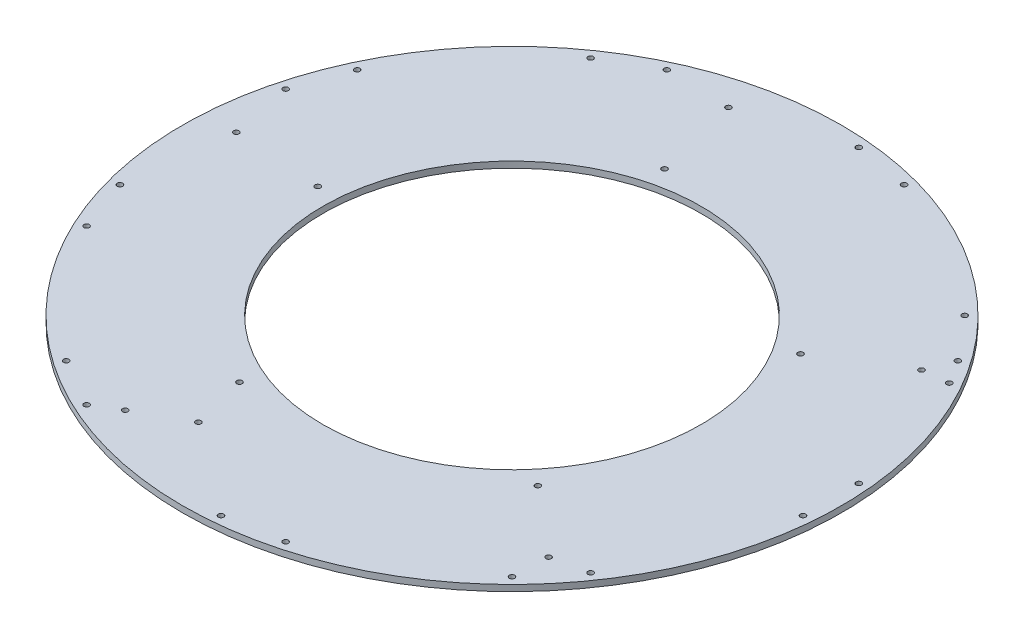
ISO-10303-21;
HEADER;
FILE_DESCRIPTION(('STEP AP214'),'2;1');
FILE_NAME('part.step','',(''),(''),'','','');
FILE_SCHEMA(('AUTOMOTIVE_DESIGN { 1 0 10303 214 1 1 1 1 }'));
ENDSEC;
DATA;
#1=APPLICATION_CONTEXT('core data for automotive mechanical design processes');
#2=APPLICATION_PROTOCOL_DEFINITION('international standard','automotive_design',2000,#1);
#3=PRODUCT_CONTEXT('',#1,'mechanical');
#4=PRODUCT('Part','Part','',(#3));
#5=PRODUCT_RELATED_PRODUCT_CATEGORY('part','',(#4));
#6=PRODUCT_DEFINITION_FORMATION('','',#4);
#7=PRODUCT_DEFINITION_CONTEXT('part definition',#1,'design');
#8=PRODUCT_DEFINITION('design','',#6,#7);
#9=PRODUCT_DEFINITION_SHAPE('','',#8);
#10=(LENGTH_UNIT() NAMED_UNIT(*) SI_UNIT(.MILLI.,.METRE.));
#11=(NAMED_UNIT(*) PLANE_ANGLE_UNIT() SI_UNIT($,.RADIAN.));
#12=(NAMED_UNIT(*) SI_UNIT($,.STERADIAN.) SOLID_ANGLE_UNIT());
#13=UNCERTAINTY_MEASURE_WITH_UNIT(LENGTH_MEASURE(1.E-05),#10,'distance_accuracy_value','');
#14=(GEOMETRIC_REPRESENTATION_CONTEXT(3) GLOBAL_UNCERTAINTY_ASSIGNED_CONTEXT((#13)) GLOBAL_UNIT_ASSIGNED_CONTEXT((#10,
#11,#12)) REPRESENTATION_CONTEXT('',''));
#15=CARTESIAN_POINT('',(0.,0.,0.));
#16=DIRECTION('',(0.,0.,1.));
#17=DIRECTION('',(1.,0.,0.));
#18=AXIS2_PLACEMENT_3D('',#15,#16,#17);
#19=CARTESIAN_POINT('',(0.,5.842,0.));
#20=DIRECTION('',(0.,1.,0.));
#21=DIRECTION('',(0.,0.,1.));
#22=AXIS2_PLACEMENT_3D('',#19,#20,#21);
#23=PLANE('',#22);
#24=CARTESIAN_POINT('',(-60.4787332351286,5.842,234.445699952621));
#25=DIRECTION('',(0.,1.,0.));
#26=DIRECTION('',(0.,0.,1.));
#27=AXIS2_PLACEMENT_3D('',#24,#25,#26);
#28=CIRCLE('',#27,2.5527);
#29=CARTESIAN_POINT('',(-60.4787332351286,5.842,236.998399952621));
#30=VERTEX_POINT('',#29);
#31=EDGE_CURVE('E223',#30,#30,#28,.T.);
#32=ORIENTED_EDGE('',*,*,#31,.F.);
#33=EDGE_LOOP('',(#32));
#34=FACE_BOUND('',#33,.T.);
#35=CARTESIAN_POINT('',(260.664986285079,5.842,-150.494999999998));
#36=DIRECTION('',(0.,1.,0.));
#37=DIRECTION('',(0.,0.,1.));
#38=AXIS2_PLACEMENT_3D('',#35,#36,#37);
#39=CIRCLE('',#38,2.55270000000006);
#40=CARTESIAN_POINT('',(260.664986285079,5.842,-147.942299999998));
#41=VERTEX_POINT('',#40);
#42=EDGE_CURVE('E217',#41,#41,#39,.T.);
#43=ORIENTED_EDGE('',*,*,#42,.F.);
#44=EDGE_LOOP('',(#43));
#45=FACE_BOUND('',#44,.T.);
#46=CARTESIAN_POINT('',(-104.665082200409,5.842,259.055168965959));
#47=DIRECTION('',(0.,1.,0.));
#48=DIRECTION('',(0.95105651629515,0.,0.309016994374958));
#49=AXIS2_PLACEMENT_3D('',#46,#47,#48);
#50=CIRCLE('',#49,2.55270000000004);
#51=CARTESIAN_POINT('',(-102.237320231262,5.842,259.8439966475));
#52=VERTEX_POINT('',#51);
#53=EDGE_CURVE('E175',#52,#52,#50,.T.);
#54=ORIENTED_EDGE('',*,*,#53,.F.);
#55=EDGE_LOOP('',(#54));
#56=FACE_BOUND('',#55,.T.);
#57=CARTESIAN_POINT('',(-73.7413079139244,5.842,182.516141771471));
#58=DIRECTION('',(0.,1.,0.));
#59=DIRECTION('',(0.95105651629515,0.,0.309016994374958));
#60=AXIS2_PLACEMENT_3D('',#57,#58,#59);
#61=CIRCLE('',#60,2.55269999999998);
#62=CARTESIAN_POINT('',(-71.3135459447778,5.842,183.304969453012));
#63=VERTEX_POINT('',#62);
#64=EDGE_CURVE('E182',#63,#63,#61,.T.);
#65=ORIENTED_EDGE('',*,*,#64,.F.);
#66=EDGE_LOOP('',(#65));
#67=FACE_BOUND('',#66,.T.);
#68=CARTESIAN_POINT('',(214.032817407441,5.842,179.594858146421));
#69=DIRECTION('',(0.,1.,0.));
#70=DIRECTION('',(0.58778525229248,0.,-0.809016994374942));
#71=AXIS2_PLACEMENT_3D('',#68,#69,#70);
#72=CIRCLE('',#71,2.55270000000004);
#73=CARTESIAN_POINT('',(215.533256820968,5.842,177.52968046488));
#74=VERTEX_POINT('',#73);
#75=EDGE_CURVE('E188',#74,#74,#72,.T.);
#76=ORIENTED_EDGE('',*,*,#75,.F.);
#77=EDGE_LOOP('',(#76));
#78=FACE_BOUND('',#77,.T.);
#79=CARTESIAN_POINT('',(-67.5929776305464,5.842,-271.100625921514));
#80=DIRECTION('',(0.,1.,0.));
#81=DIRECTION('',(-0.951056516295155,0.,0.309016994374945));
#82=AXIS2_PLACEMENT_3D('',#79,#80,#81);
#83=CIRCLE('',#82,2.55270000000004);
#84=CARTESIAN_POINT('',(-70.0207395996931,5.842,-270.311798239973));
#85=VERTEX_POINT('',#84);
#86=EDGE_CURVE('E202',#85,#85,#83,.T.);
#87=ORIENTED_EDGE('',*,*,#86,.F.);
#88=EDGE_LOOP('',(#87));
#89=FACE_BOUND('',#88,.T.);
#90=CARTESIAN_POINT('',(166.938267728393,5.842,-104.314607164305));
#91=DIRECTION('',(0.,1.,0.));
#92=DIRECTION('',(-0.587785252292469,0.,-0.809016994374951));
#93=AXIS2_PLACEMENT_3D('',#90,#91,#92);
#94=CIRCLE('',#93,2.55269999999998);
#95=CARTESIAN_POINT('',(165.437828314866,5.842,-106.379784845846));
#96=VERTEX_POINT('',#95);
#97=EDGE_CURVE('E195',#96,#96,#94,.T.);
#98=ORIENTED_EDGE('',*,*,#97,.F.);
#99=EDGE_LOOP('',(#98));
#100=FACE_BOUND('',#99,.T.);
#101=CARTESIAN_POINT('',(236.944638066106,5.842,-148.059442426756));
#102=DIRECTION('',(0.,1.,0.));
#103=DIRECTION('',(-0.587785252292469,0.,-0.809016994374951));
#104=AXIS2_PLACEMENT_3D('',#101,#102,#103);
#105=CIRCLE('',#104,2.55270000000004);
#106=CARTESIAN_POINT('',(235.444198652579,5.842,-150.124620108297));
#107=VERTEX_POINT('',#106);
#108=EDGE_CURVE('E212',#107,#107,#105,.T.);
#109=ORIENTED_EDGE('',*,*,#108,.F.);
#110=EDGE_LOOP('',(#109));
#111=FACE_BOUND('',#110,.T.);
#112=CARTESIAN_POINT('',(150.79584862797,5.842,126.532740966797));
#113=DIRECTION('',(0.,1.,0.));
#114=DIRECTION('',(0.58778525229248,0.,-0.809016994374942));
#115=AXIS2_PLACEMENT_3D('',#112,#113,#114);
#116=CIRCLE('',#115,2.55269999999998);
#117=CARTESIAN_POINT('',(152.296288041497,5.842,124.467563285256));
#118=VERTEX_POINT('',#117);
#119=EDGE_CURVE('E194',#118,#118,#116,.T.);
#120=ORIENTED_EDGE('',*,*,#119,.F.);
#121=EDGE_LOOP('',(#120));
#122=FACE_BOUND('',#121,.T.);
#123=CARTESIAN_POINT('',(-47.6223251487941,5.842,-191.00271371743));
#124=DIRECTION('',(0.,1.,0.));
#125=DIRECTION('',(-0.951056516295155,0.,0.309016994374945));
#126=AXIS2_PLACEMENT_3D('',#123,#124,#125);
#127=CIRCLE('',#126,2.55269999999998);
#128=CARTESIAN_POINT('',(-50.0500871179407,5.842,-190.213886035889));
#129=VERTEX_POINT('',#128);
#130=EDGE_CURVE('E169',#129,#129,#127,.T.);
#131=ORIENTED_EDGE('',*,*,#130,.F.);
#132=EDGE_LOOP('',(#131));
#133=FACE_BOUND('',#132,.T.);
#134=CARTESIAN_POINT('',(-196.370483293646,5.842,-13.7315618565311));
#135=DIRECTION('',(0.,1.,0.));
#136=DIRECTION('',(0.,0.,1.));
#137=AXIS2_PLACEMENT_3D('',#134,#135,#136);
#138=CIRCLE('',#137,2.55269999999998);
#139=CARTESIAN_POINT('',(-196.370483293646,5.842,-11.1788618565311));
#140=VERTEX_POINT('',#139);
#141=EDGE_CURVE('E164',#140,#140,#138,.T.);
#142=ORIENTED_EDGE('',*,*,#141,.F.);
#143=EDGE_LOOP('',(#142));
#144=FACE_BOUND('',#143,.T.);
#145=CARTESIAN_POINT('',(-278.719395642595,5.842,-19.4899587641086));
#146=DIRECTION('',(0.,1.,0.));
#147=DIRECTION('',(0.,0.,1.));
#148=AXIS2_PLACEMENT_3D('',#145,#146,#147);
#149=CIRCLE('',#148,2.55270000000004);
#150=CARTESIAN_POINT('',(-278.719395642595,5.842,-16.9372587641086));
#151=VERTEX_POINT('',#150);
#152=EDGE_CURVE('E157',#151,#151,#149,.T.);
#153=ORIENTED_EDGE('',*,*,#152,.F.);
#154=EDGE_LOOP('',(#153));
#155=FACE_BOUND('',#154,.T.);
#156=CARTESIAN_POINT('',(-272.789580820163,5.842,127.20387060133));
#157=DIRECTION('',(0.,1.,0.));
#158=DIRECTION('',(0.64278760968653,0.,0.766044443118986));
#159=AXIS2_PLACEMENT_3D('',#156,#157,#158);
#160=CIRCLE('',#159,2.55270000000004);
#161=CARTESIAN_POINT('',(-271.148736888916,5.842,129.15935225128));
#162=VERTEX_POINT('',#161);
#163=EDGE_CURVE('E67',#162,#162,#160,.T.);
#164=ORIENTED_EDGE('',*,*,#163,.F.);
#165=EDGE_LOOP('',(#164));
#166=FACE_BOUND('',#165,.T.);
#167=CARTESIAN_POINT('',(-172.640771577304,5.842,246.556573810542));
#168=DIRECTION('',(0.,1.,0.));
#169=DIRECTION('',(0.64278760968653,0.,0.766044443118986));
#170=AXIS2_PLACEMENT_3D('',#167,#168,#169);
#171=CIRCLE('',#170,2.55270000000004);
#172=CARTESIAN_POINT('',(-170.999927646057,5.842,248.512055460492));
#173=VERTEX_POINT('',#172);
#174=EDGE_CURVE('E74',#173,#173,#171,.T.);
#175=ORIENTED_EDGE('',*,*,#174,.F.);
#176=EDGE_LOOP('',(#175));
#177=FACE_BOUND('',#176,.T.);
#178=CARTESIAN_POINT('',(-127.203870601336,5.842,272.78958082016));
#179=DIRECTION('',(0.,1.,0.));
#180=DIRECTION('',(0.984807753012206,0.,0.17364817766694));
#181=AXIS2_PLACEMENT_3D('',#178,#179,#180);
#182=CIRCLE('',#181,2.55270000000004);
#183=CARTESIAN_POINT('',(-124.689951850222,5.842,273.23285252329));
#184=VERTEX_POINT('',#183);
#185=EDGE_CURVE('E80',#184,#184,#182,.T.);
#186=ORIENTED_EDGE('',*,*,#185,.F.);
#187=EDGE_LOOP('',(#186));
#188=FACE_BOUND('',#187,.T.);
#189=CARTESIAN_POINT('',(26.2330070096147,5.842,299.844642178635));
#190=DIRECTION('',(0.,1.,0.));
#191=DIRECTION('',(0.984807753012206,0.,0.17364817766694));
#192=AXIS2_PLACEMENT_3D('',#189,#190,#191);
#193=CIRCLE('',#192,2.55270000000004);
#194=CARTESIAN_POINT('',(28.746925760729,5.842,300.287913881765));
#195=VERTEX_POINT('',#194);
#196=EDGE_CURVE('E86',#195,#195,#193,.T.);
#197=ORIENTED_EDGE('',*,*,#196,.F.);
#198=EDGE_LOOP('',(#197));
#199=FACE_BOUND('',#198,.T.);
#200=CARTESIAN_POINT('',(77.9019443854049,5.842,290.734014454747));
#201=DIRECTION('',(0.,1.,0.));
#202=DIRECTION('',(0.866025403784443,0.,-0.499999999999992));
#203=AXIS2_PLACEMENT_3D('',#200,#201,#202);
#204=CIRCLE('',#203,2.55270000000004);
#205=CARTESIAN_POINT('',(80.1126474336454,5.842,289.457664454747));
#206=VERTEX_POINT('',#205);
#207=EDGE_CURVE('E92',#206,#206,#204,.T.);
#208=ORIENTED_EDGE('',*,*,#207,.F.);
#209=EDGE_LOOP('',(#208));
#210=FACE_BOUND('',#209,.T.);
#211=CARTESIAN_POINT('',(212.832070069337,5.842,212.832070069341));
#212=DIRECTION('',(0.,1.,0.));
#213=DIRECTION('',(0.866025403784443,0.,-0.499999999999992));
#214=AXIS2_PLACEMENT_3D('',#211,#212,#213);
#215=CIRCLE('',#214,2.55270000000004);
#216=CARTESIAN_POINT('',(215.042773117578,5.842,211.555720069341));
#217=VERTEX_POINT('',#216);
#218=EDGE_CURVE('E98',#217,#217,#215,.T.);
#219=ORIENTED_EDGE('',*,*,#218,.F.);
#220=EDGE_LOOP('',(#219));
#221=FACE_BOUND('',#220,.T.);
#222=CARTESIAN_POINT('',(246.556573810542,5.842,172.640771577303));
#223=DIRECTION('',(0.,1.,0.));
#224=DIRECTION('',(0.342020143325676,0.,-0.939692620785906));
#225=AXIS2_PLACEMENT_3D('',#222,#223,#224);
#226=CIRCLE('',#225,2.55270000000004);
#227=CARTESIAN_POINT('',(247.42964863041,5.842,170.242018224223));
#228=VERTEX_POINT('',#227);
#229=EDGE_CURVE('E104',#228,#228,#226,.T.);
#230=ORIENTED_EDGE('',*,*,#229,.F.);
#231=EDGE_LOOP('',(#230));
#232=FACE_BOUND('',#231,.T.);
#233=CARTESIAN_POINT('',(299.844642178634,5.842,26.2330070096197));
#234=DIRECTION('',(0.,1.,0.));
#235=DIRECTION('',(0.342020143325676,0.,-0.939692620785906));
#236=AXIS2_PLACEMENT_3D('',#233,#234,#235);
#237=CIRCLE('',#236,2.55270000000004);
#238=CARTESIAN_POINT('',(300.717716998502,5.842,23.8342536565395));
#239=VERTEX_POINT('',#238);
#240=EDGE_CURVE('E110',#239,#239,#237,.T.);
#241=ORIENTED_EDGE('',*,*,#240,.F.);
#242=EDGE_LOOP('',(#241));
#243=FACE_BOUND('',#242,.T.);
#244=CARTESIAN_POINT('',(299.844642178635,5.842,-26.2330070096156));
#245=DIRECTION('',(0.,1.,0.));
#246=DIRECTION('',(-0.342020143325663,0.,-0.939692620785911));
#247=AXIS2_PLACEMENT_3D('',#244,#245,#246);
#248=CIRCLE('',#247,2.55270000000004);
#249=CARTESIAN_POINT('',(298.971567358767,5.842,-28.6317603626959));
#250=VERTEX_POINT('',#249);
#251=EDGE_CURVE('E116',#250,#250,#248,.T.);
#252=ORIENTED_EDGE('',*,*,#251,.F.);
#253=EDGE_LOOP('',(#252));
#254=FACE_BOUND('',#253,.T.);
#255=CARTESIAN_POINT('',(246.556573810545,5.842,-172.6407715773));
#256=DIRECTION('',(0.,1.,0.));
#257=DIRECTION('',(-0.342020143325663,0.,-0.939692620785911));
#258=AXIS2_PLACEMENT_3D('',#255,#256,#257);
#259=CIRCLE('',#258,2.55270000000004);
#260=CARTESIAN_POINT('',(245.683498990677,5.842,-175.03952493038));
#261=VERTEX_POINT('',#260);
#262=EDGE_CURVE('E122',#261,#261,#259,.T.);
#263=ORIENTED_EDGE('',*,*,#262,.F.);
#264=EDGE_LOOP('',(#263));
#265=FACE_BOUND('',#264,.T.);
#266=CARTESIAN_POINT('',(212.83207006934,5.842,-212.832070069338));
#267=DIRECTION('',(0.,1.,0.));
#268=DIRECTION('',(-0.866025403784436,0.,-0.500000000000004));
#269=AXIS2_PLACEMENT_3D('',#266,#267,#268);
#270=CIRCLE('',#269,2.55270000000004);
#271=CARTESIAN_POINT('',(210.6213670211,5.842,-214.108420069338));
#272=VERTEX_POINT('',#271);
#273=EDGE_CURVE('E128',#272,#272,#270,.T.);
#274=ORIENTED_EDGE('',*,*,#273,.F.);
#275=EDGE_LOOP('',(#274));
#276=FACE_BOUND('',#275,.T.);
#277=CARTESIAN_POINT('',(77.9019443854089,5.842,-290.734014454746));
#278=DIRECTION('',(0.,1.,0.));
#279=DIRECTION('',(-0.866025403784436,0.,-0.500000000000004));
#280=AXIS2_PLACEMENT_3D('',#277,#278,#279);
#281=CIRCLE('',#280,2.55270000000004);
#282=CARTESIAN_POINT('',(75.6912413371684,5.842,-292.010364454746));
#283=VERTEX_POINT('',#282);
#284=EDGE_CURVE('E134',#283,#283,#281,.T.);
#285=ORIENTED_EDGE('',*,*,#284,.F.);
#286=EDGE_LOOP('',(#285));
#287=FACE_BOUND('',#286,.T.);
#288=CARTESIAN_POINT('',(26.2330070096187,5.842,-299.844642178634));
#289=DIRECTION('',(0.,1.,0.));
#290=DIRECTION('',(-0.984807753012209,0.,0.173648177666927));
#291=AXIS2_PLACEMENT_3D('',#288,#289,#290);
#292=CIRCLE('',#291,2.55270000000004);
#293=CARTESIAN_POINT('',(23.7190882585044,5.842,-299.401370475504));
#294=VERTEX_POINT('',#293);
#295=EDGE_CURVE('E140',#294,#294,#292,.T.);
#296=ORIENTED_EDGE('',*,*,#295,.F.);
#297=EDGE_LOOP('',(#296));
#298=FACE_BOUND('',#297,.T.);
#299=CARTESIAN_POINT('',(-127.203870601332,5.842,-272.789580820162));
#300=DIRECTION('',(0.,1.,0.));
#301=DIRECTION('',(-0.984807753012209,0.,0.173648177666927));
#302=AXIS2_PLACEMENT_3D('',#299,#300,#301);
#303=CIRCLE('',#302,2.55270000000004);
#304=CARTESIAN_POINT('',(-129.717789352447,5.842,-272.346309117031));
#305=VERTEX_POINT('',#304);
#306=EDGE_CURVE('E146',#305,#305,#303,.T.);
#307=ORIENTED_EDGE('',*,*,#306,.F.);
#308=EDGE_LOOP('',(#307));
#309=FACE_BOUND('',#308,.T.);
#310=CARTESIAN_POINT('',(-172.640771577301,5.842,-246.556573810544));
#311=DIRECTION('',(0.,1.,0.));
#312=DIRECTION('',(-0.642787609686541,0.,0.766044443118977));
#313=AXIS2_PLACEMENT_3D('',#310,#311,#312);
#314=CIRCLE('',#313,2.55270000000004);
#315=CARTESIAN_POINT('',(-174.281615508548,5.842,-244.601092160594));
#316=VERTEX_POINT('',#315);
#317=EDGE_CURVE('E152',#316,#316,#314,.T.);
#318=ORIENTED_EDGE('',*,*,#317,.F.);
#319=EDGE_LOOP('',(#318));
#320=FACE_BOUND('',#319,.T.);
#321=CARTESIAN_POINT('',(-272.789580820161,5.842,-127.203870601333));
#322=DIRECTION('',(0.,1.,0.));
#323=DIRECTION('',(-0.642787609686541,0.,0.766044443118977));
#324=AXIS2_PLACEMENT_3D('',#321,#322,#323);
#325=CIRCLE('',#324,2.55270000000004);
#326=CARTESIAN_POINT('',(-274.430424751408,5.842,-125.248388951384));
#327=VERTEX_POINT('',#326);
#328=EDGE_CURVE('E61',#327,#327,#325,.T.);
#329=ORIENTED_EDGE('',*,*,#328,.F.);
#330=EDGE_LOOP('',(#329));
#331=FACE_BOUND('',#330,.T.);
#332=CARTESIAN_POINT('',(-290.734014454747,5.842,77.9019443854079));
#333=DIRECTION('',(0.,1.,0.));
#334=DIRECTION('',(0.,0.,1.));
#335=AXIS2_PLACEMENT_3D('',#332,#333,#334);
#336=CIRCLE('',#335,2.55270000000004);
#337=CARTESIAN_POINT('',(-290.734014454747,5.842,80.4546443854079));
#338=VERTEX_POINT('',#337);
#339=EDGE_CURVE('E56',#338,#338,#336,.T.);
#340=ORIENTED_EDGE('',*,*,#339,.F.);
#341=EDGE_LOOP('',(#340));
#342=FACE_BOUND('',#341,.T.);
#343=CARTESIAN_POINT('',(-290.734014454747,5.842,-77.9019443854079));
#344=DIRECTION('',(0.,1.,0.));
#345=DIRECTION('',(0.,0.,1.));
#346=AXIS2_PLACEMENT_3D('',#343,#344,#345);
#347=CIRCLE('',#346,2.55270000000004);
#348=CARTESIAN_POINT('',(-290.734014454747,5.842,-75.3492443854079));
#349=VERTEX_POINT('',#348);
#350=EDGE_CURVE('E49',#349,#349,#347,.T.);
#351=ORIENTED_EDGE('',*,*,#350,.F.);
#352=EDGE_LOOP('',(#351));
#353=FACE_BOUND('',#352,.T.);
#354=CARTESIAN_POINT('',(0.,5.842,0.));
#355=DIRECTION('',(0.,1.,0.));
#356=DIRECTION('',(0.,0.,1.));
#357=AXIS2_PLACEMENT_3D('',#354,#355,#356);
#358=CIRCLE('',#357,309.88);
#359=CARTESIAN_POINT('',(0.,5.842,309.88));
#360=VERTEX_POINT('',#359);
#361=EDGE_CURVE('E10',#360,#360,#358,.T.);
#362=ORIENTED_EDGE('',*,*,#361,.T.);
#363=EDGE_LOOP('',(#362));
#364=FACE_BOUND('',#363,.T.);
#365=CARTESIAN_POINT('',(0.,5.842,0.));
#366=DIRECTION('',(0.,1.,0.));
#367=DIRECTION('',(0.,0.,1.));
#368=AXIS2_PLACEMENT_3D('',#365,#366,#367);
#369=CIRCLE('',#368,177.8);
#370=CARTESIAN_POINT('',(0.,5.842,177.8));
#371=VERTEX_POINT('',#370);
#372=EDGE_CURVE('E41',#371,#371,#369,.T.);
#373=ORIENTED_EDGE('',*,*,#372,.F.);
#374=EDGE_LOOP('',(#373));
#375=FACE_BOUND('',#374,.T.);
#376=ADVANCED_FACE('F30',(#34,#45,#56,#67,#78,#89,#100,#111,#122,#133,#144,#155,#166,#177,#188,
#199,#210,#221,#232,#243,#254,#265,#276,#287,#298,#309,#320,#331,#342,#353,#364,#375),#23,.T.);
#377=CARTESIAN_POINT('',(0.,0.,0.));
#378=DIRECTION('',(0.,1.,0.));
#379=DIRECTION('',(0.,0.,1.));
#380=AXIS2_PLACEMENT_3D('',#377,#378,#379);
#381=PLANE('',#380);
#382=CARTESIAN_POINT('',(-60.4787332351286,0.,234.445699952621));
#383=DIRECTION('',(0.,1.,0.));
#384=DIRECTION('',(0.,0.,1.));
#385=AXIS2_PLACEMENT_3D('',#382,#383,#384);
#386=CIRCLE('',#385,2.5527);
#387=CARTESIAN_POINT('',(-60.4787332351286,0.,236.998399952621));
#388=VERTEX_POINT('',#387);
#389=EDGE_CURVE('E220',#388,#388,#386,.T.);
#390=ORIENTED_EDGE('',*,*,#389,.T.);
#391=EDGE_LOOP('',(#390));
#392=FACE_BOUND('',#391,.T.);
#393=CARTESIAN_POINT('',(260.664986285079,0.,-150.494999999998));
#394=DIRECTION('',(0.,1.,0.));
#395=DIRECTION('',(0.,0.,1.));
#396=AXIS2_PLACEMENT_3D('',#393,#394,#395);
#397=CIRCLE('',#396,2.55270000000006);
#398=CARTESIAN_POINT('',(260.664986285079,0.,-147.942299999998));
#399=VERTEX_POINT('',#398);
#400=EDGE_CURVE('E179',#399,#399,#397,.T.);
#401=ORIENTED_EDGE('',*,*,#400,.T.);
#402=EDGE_LOOP('',(#401));
#403=FACE_BOUND('',#402,.T.);
#404=CARTESIAN_POINT('',(-104.665082200409,0.,259.055168965959));
#405=DIRECTION('',(0.,1.,0.));
#406=DIRECTION('',(0.95105651629515,0.,0.309016994374958));
#407=AXIS2_PLACEMENT_3D('',#404,#405,#406);
#408=CIRCLE('',#407,2.55270000000004);
#409=CARTESIAN_POINT('',(-102.237320231262,0.,259.8439966475));
#410=VERTEX_POINT('',#409);
#411=EDGE_CURVE('E178',#410,#410,#408,.T.);
#412=ORIENTED_EDGE('',*,*,#411,.T.);
#413=EDGE_LOOP('',(#412));
#414=FACE_BOUND('',#413,.T.);
#415=CARTESIAN_POINT('',(-73.7413079139244,0.,182.516141771471));
#416=DIRECTION('',(0.,1.,0.));
#417=DIRECTION('',(0.95105651629515,0.,0.309016994374958));
#418=AXIS2_PLACEMENT_3D('',#415,#416,#417);
#419=CIRCLE('',#418,2.55269999999998);
#420=CARTESIAN_POINT('',(-71.3135459447778,0.,183.304969453012));
#421=VERTEX_POINT('',#420);
#422=EDGE_CURVE('E185',#421,#421,#419,.T.);
#423=ORIENTED_EDGE('',*,*,#422,.T.);
#424=EDGE_LOOP('',(#423));
#425=FACE_BOUND('',#424,.T.);
#426=CARTESIAN_POINT('',(214.032817407441,0.,179.594858146421));
#427=DIRECTION('',(0.,1.,0.));
#428=DIRECTION('',(0.58778525229248,0.,-0.809016994374942));
#429=AXIS2_PLACEMENT_3D('',#426,#427,#428);
#430=CIRCLE('',#429,2.55270000000004);
#431=CARTESIAN_POINT('',(215.533256820968,0.,177.52968046488));
#432=VERTEX_POINT('',#431);
#433=EDGE_CURVE('E191',#432,#432,#430,.T.);
#434=ORIENTED_EDGE('',*,*,#433,.T.);
#435=EDGE_LOOP('',(#434));
#436=FACE_BOUND('',#435,.T.);
#437=CARTESIAN_POINT('',(-67.5929776305464,0.,-271.100625921514));
#438=DIRECTION('',(0.,1.,0.));
#439=DIRECTION('',(-0.951056516295155,0.,0.309016994374945));
#440=AXIS2_PLACEMENT_3D('',#437,#438,#439);
#441=CIRCLE('',#440,2.55270000000004);
#442=CARTESIAN_POINT('',(-70.0207395996931,0.,-270.311798239973));
#443=VERTEX_POINT('',#442);
#444=EDGE_CURVE('E172',#443,#443,#441,.T.);
#445=ORIENTED_EDGE('',*,*,#444,.T.);
#446=EDGE_LOOP('',(#445));
#447=FACE_BOUND('',#446,.T.);
#448=CARTESIAN_POINT('',(166.938267728393,0.,-104.314607164305));
#449=DIRECTION('',(0.,1.,0.));
#450=DIRECTION('',(-0.587785252292469,0.,-0.809016994374951));
#451=AXIS2_PLACEMENT_3D('',#448,#449,#450);
#452=CIRCLE('',#451,2.55269999999998);
#453=CARTESIAN_POINT('',(165.437828314866,0.,-106.379784845846));
#454=VERTEX_POINT('',#453);
#455=EDGE_CURVE('E198',#454,#454,#452,.T.);
#456=ORIENTED_EDGE('',*,*,#455,.T.);
#457=EDGE_LOOP('',(#456));
#458=FACE_BOUND('',#457,.T.);
#459=CARTESIAN_POINT('',(236.944638066106,0.,-148.059442426756));
#460=DIRECTION('',(0.,1.,0.));
#461=DIRECTION('',(-0.587785252292469,0.,-0.809016994374951));
#462=AXIS2_PLACEMENT_3D('',#459,#460,#461);
#463=CIRCLE('',#462,2.55270000000004);
#464=CARTESIAN_POINT('',(235.444198652579,0.,-150.124620108297));
#465=VERTEX_POINT('',#464);
#466=EDGE_CURVE('E199',#465,#465,#463,.T.);
#467=ORIENTED_EDGE('',*,*,#466,.T.);
#468=EDGE_LOOP('',(#467));
#469=FACE_BOUND('',#468,.T.);
#470=CARTESIAN_POINT('',(150.79584862797,0.,126.532740966797));
#471=DIRECTION('',(0.,1.,0.));
#472=DIRECTION('',(0.58778525229248,0.,-0.809016994374942));
#473=AXIS2_PLACEMENT_3D('',#470,#471,#472);
#474=CIRCLE('',#473,2.55269999999998);
#475=CARTESIAN_POINT('',(152.296288041497,0.,124.467563285256));
#476=VERTEX_POINT('',#475);
#477=EDGE_CURVE('E209',#476,#476,#474,.T.);
#478=ORIENTED_EDGE('',*,*,#477,.T.);
#479=EDGE_LOOP('',(#478));
#480=FACE_BOUND('',#479,.T.);
#481=CARTESIAN_POINT('',(-47.6223251487941,0.,-191.00271371743));
#482=DIRECTION('',(0.,1.,0.));
#483=DIRECTION('',(-0.951056516295155,0.,0.309016994374945));
#484=AXIS2_PLACEMENT_3D('',#481,#482,#483);
#485=CIRCLE('',#484,2.55269999999998);
#486=CARTESIAN_POINT('',(-50.0500871179407,0.,-190.213886035889));
#487=VERTEX_POINT('',#486);
#488=EDGE_CURVE('E161',#487,#487,#485,.T.);
#489=ORIENTED_EDGE('',*,*,#488,.T.);
#490=EDGE_LOOP('',(#489));
#491=FACE_BOUND('',#490,.T.);
#492=CARTESIAN_POINT('',(-196.370483293646,0.,-13.7315618565311));
#493=DIRECTION('',(0.,1.,0.));
#494=DIRECTION('',(0.,0.,1.));
#495=AXIS2_PLACEMENT_3D('',#492,#493,#494);
#496=CIRCLE('',#495,2.55269999999998);
#497=CARTESIAN_POINT('',(-196.370483293646,0.,-11.1788618565311));
#498=VERTEX_POINT('',#497);
#499=EDGE_CURVE('E71',#498,#498,#496,.T.);
#500=ORIENTED_EDGE('',*,*,#499,.T.);
#501=EDGE_LOOP('',(#500));
#502=FACE_BOUND('',#501,.T.);
#503=CARTESIAN_POINT('',(-278.719395642595,0.,-19.4899587641086));
#504=DIRECTION('',(0.,1.,0.));
#505=DIRECTION('',(0.,0.,1.));
#506=AXIS2_PLACEMENT_3D('',#503,#504,#505);
#507=CIRCLE('',#506,2.55270000000004);
#508=CARTESIAN_POINT('',(-278.719395642595,0.,-16.9372587641086));
#509=VERTEX_POINT('',#508);
#510=EDGE_CURVE('E160',#509,#509,#507,.T.);
#511=ORIENTED_EDGE('',*,*,#510,.T.);
#512=EDGE_LOOP('',(#511));
#513=FACE_BOUND('',#512,.T.);
#514=CARTESIAN_POINT('',(-272.789580820163,0.,127.20387060133));
#515=DIRECTION('',(0.,1.,0.));
#516=DIRECTION('',(0.64278760968653,0.,0.766044443118986));
#517=AXIS2_PLACEMENT_3D('',#514,#515,#516);
#518=CIRCLE('',#517,2.55270000000004);
#519=CARTESIAN_POINT('',(-271.148736888916,0.,129.15935225128));
#520=VERTEX_POINT('',#519);
#521=EDGE_CURVE('E70',#520,#520,#518,.T.);
#522=ORIENTED_EDGE('',*,*,#521,.T.);
#523=EDGE_LOOP('',(#522));
#524=FACE_BOUND('',#523,.T.);
#525=CARTESIAN_POINT('',(-172.640771577304,0.,246.556573810542));
#526=DIRECTION('',(0.,1.,0.));
#527=DIRECTION('',(0.64278760968653,0.,0.766044443118986));
#528=AXIS2_PLACEMENT_3D('',#525,#526,#527);
#529=CIRCLE('',#528,2.55270000000004);
#530=CARTESIAN_POINT('',(-170.999927646057,0.,248.512055460492));
#531=VERTEX_POINT('',#530);
#532=EDGE_CURVE('E77',#531,#531,#529,.T.);
#533=ORIENTED_EDGE('',*,*,#532,.T.);
#534=EDGE_LOOP('',(#533));
#535=FACE_BOUND('',#534,.T.);
#536=CARTESIAN_POINT('',(-127.203870601336,0.,272.78958082016));
#537=DIRECTION('',(0.,1.,0.));
#538=DIRECTION('',(0.984807753012206,0.,0.17364817766694));
#539=AXIS2_PLACEMENT_3D('',#536,#537,#538);
#540=CIRCLE('',#539,2.55270000000004);
#541=CARTESIAN_POINT('',(-124.689951850222,0.,273.23285252329));
#542=VERTEX_POINT('',#541);
#543=EDGE_CURVE('E83',#542,#542,#540,.T.);
#544=ORIENTED_EDGE('',*,*,#543,.T.);
#545=EDGE_LOOP('',(#544));
#546=FACE_BOUND('',#545,.T.);
#547=CARTESIAN_POINT('',(26.2330070096147,0.,299.844642178635));
#548=DIRECTION('',(0.,1.,0.));
#549=DIRECTION('',(0.984807753012206,0.,0.17364817766694));
#550=AXIS2_PLACEMENT_3D('',#547,#548,#549);
#551=CIRCLE('',#550,2.55270000000004);
#552=CARTESIAN_POINT('',(28.746925760729,0.,300.287913881765));
#553=VERTEX_POINT('',#552);
#554=EDGE_CURVE('E89',#553,#553,#551,.T.);
#555=ORIENTED_EDGE('',*,*,#554,.T.);
#556=EDGE_LOOP('',(#555));
#557=FACE_BOUND('',#556,.T.);
#558=CARTESIAN_POINT('',(77.9019443854049,0.,290.734014454747));
#559=DIRECTION('',(0.,1.,0.));
#560=DIRECTION('',(0.866025403784443,0.,-0.499999999999992));
#561=AXIS2_PLACEMENT_3D('',#558,#559,#560);
#562=CIRCLE('',#561,2.55270000000004);
#563=CARTESIAN_POINT('',(80.1126474336454,0.,289.457664454747));
#564=VERTEX_POINT('',#563);
#565=EDGE_CURVE('E95',#564,#564,#562,.T.);
#566=ORIENTED_EDGE('',*,*,#565,.T.);
#567=EDGE_LOOP('',(#566));
#568=FACE_BOUND('',#567,.T.);
#569=CARTESIAN_POINT('',(212.832070069337,0.,212.832070069341));
#570=DIRECTION('',(0.,1.,0.));
#571=DIRECTION('',(0.866025403784443,0.,-0.499999999999992));
#572=AXIS2_PLACEMENT_3D('',#569,#570,#571);
#573=CIRCLE('',#572,2.55270000000004);
#574=CARTESIAN_POINT('',(215.042773117578,0.,211.555720069341));
#575=VERTEX_POINT('',#574);
#576=EDGE_CURVE('E101',#575,#575,#573,.T.);
#577=ORIENTED_EDGE('',*,*,#576,.T.);
#578=EDGE_LOOP('',(#577));
#579=FACE_BOUND('',#578,.T.);
#580=CARTESIAN_POINT('',(246.556573810542,0.,172.640771577303));
#581=DIRECTION('',(0.,1.,0.));
#582=DIRECTION('',(0.342020143325676,0.,-0.939692620785906));
#583=AXIS2_PLACEMENT_3D('',#580,#581,#582);
#584=CIRCLE('',#583,2.55270000000004);
#585=CARTESIAN_POINT('',(247.42964863041,0.,170.242018224223));
#586=VERTEX_POINT('',#585);
#587=EDGE_CURVE('E107',#586,#586,#584,.T.);
#588=ORIENTED_EDGE('',*,*,#587,.T.);
#589=EDGE_LOOP('',(#588));
#590=FACE_BOUND('',#589,.T.);
#591=CARTESIAN_POINT('',(299.844642178634,0.,26.2330070096197));
#592=DIRECTION('',(0.,1.,0.));
#593=DIRECTION('',(0.342020143325676,0.,-0.939692620785906));
#594=AXIS2_PLACEMENT_3D('',#591,#592,#593);
#595=CIRCLE('',#594,2.55270000000004);
#596=CARTESIAN_POINT('',(300.717716998502,0.,23.8342536565395));
#597=VERTEX_POINT('',#596);
#598=EDGE_CURVE('E113',#597,#597,#595,.T.);
#599=ORIENTED_EDGE('',*,*,#598,.T.);
#600=EDGE_LOOP('',(#599));
#601=FACE_BOUND('',#600,.T.);
#602=CARTESIAN_POINT('',(299.844642178635,0.,-26.2330070096156));
#603=DIRECTION('',(0.,1.,0.));
#604=DIRECTION('',(-0.342020143325663,0.,-0.939692620785911));
#605=AXIS2_PLACEMENT_3D('',#602,#603,#604);
#606=CIRCLE('',#605,2.55270000000004);
#607=CARTESIAN_POINT('',(298.971567358767,0.,-28.6317603626959));
#608=VERTEX_POINT('',#607);
#609=EDGE_CURVE('E119',#608,#608,#606,.T.);
#610=ORIENTED_EDGE('',*,*,#609,.T.);
#611=EDGE_LOOP('',(#610));
#612=FACE_BOUND('',#611,.T.);
#613=CARTESIAN_POINT('',(246.556573810545,0.,-172.6407715773));
#614=DIRECTION('',(0.,1.,0.));
#615=DIRECTION('',(-0.342020143325663,0.,-0.939692620785911));
#616=AXIS2_PLACEMENT_3D('',#613,#614,#615);
#617=CIRCLE('',#616,2.55270000000004);
#618=CARTESIAN_POINT('',(245.683498990677,0.,-175.03952493038));
#619=VERTEX_POINT('',#618);
#620=EDGE_CURVE('E125',#619,#619,#617,.T.);
#621=ORIENTED_EDGE('',*,*,#620,.T.);
#622=EDGE_LOOP('',(#621));
#623=FACE_BOUND('',#622,.T.);
#624=CARTESIAN_POINT('',(212.83207006934,0.,-212.832070069338));
#625=DIRECTION('',(0.,1.,0.));
#626=DIRECTION('',(-0.866025403784436,0.,-0.500000000000004));
#627=AXIS2_PLACEMENT_3D('',#624,#625,#626);
#628=CIRCLE('',#627,2.55270000000004);
#629=CARTESIAN_POINT('',(210.6213670211,0.,-214.108420069338));
#630=VERTEX_POINT('',#629);
#631=EDGE_CURVE('E131',#630,#630,#628,.T.);
#632=ORIENTED_EDGE('',*,*,#631,.T.);
#633=EDGE_LOOP('',(#632));
#634=FACE_BOUND('',#633,.T.);
#635=CARTESIAN_POINT('',(77.9019443854089,0.,-290.734014454746));
#636=DIRECTION('',(0.,1.,0.));
#637=DIRECTION('',(-0.866025403784436,0.,-0.500000000000004));
#638=AXIS2_PLACEMENT_3D('',#635,#636,#637);
#639=CIRCLE('',#638,2.55270000000004);
#640=CARTESIAN_POINT('',(75.6912413371684,0.,-292.010364454746));
#641=VERTEX_POINT('',#640);
#642=EDGE_CURVE('E137',#641,#641,#639,.T.);
#643=ORIENTED_EDGE('',*,*,#642,.T.);
#644=EDGE_LOOP('',(#643));
#645=FACE_BOUND('',#644,.T.);
#646=CARTESIAN_POINT('',(26.2330070096187,0.,-299.844642178634));
#647=DIRECTION('',(0.,1.,0.));
#648=DIRECTION('',(-0.984807753012209,0.,0.173648177666927));
#649=AXIS2_PLACEMENT_3D('',#646,#647,#648);
#650=CIRCLE('',#649,2.55270000000004);
#651=CARTESIAN_POINT('',(23.7190882585044,0.,-299.401370475504));
#652=VERTEX_POINT('',#651);
#653=EDGE_CURVE('E143',#652,#652,#650,.T.);
#654=ORIENTED_EDGE('',*,*,#653,.T.);
#655=EDGE_LOOP('',(#654));
#656=FACE_BOUND('',#655,.T.);
#657=CARTESIAN_POINT('',(-127.203870601332,0.,-272.789580820162));
#658=DIRECTION('',(0.,1.,0.));
#659=DIRECTION('',(-0.984807753012209,0.,0.173648177666927));
#660=AXIS2_PLACEMENT_3D('',#657,#658,#659);
#661=CIRCLE('',#660,2.55270000000004);
#662=CARTESIAN_POINT('',(-129.717789352447,0.,-272.346309117031));
#663=VERTEX_POINT('',#662);
#664=EDGE_CURVE('E149',#663,#663,#661,.T.);
#665=ORIENTED_EDGE('',*,*,#664,.T.);
#666=EDGE_LOOP('',(#665));
#667=FACE_BOUND('',#666,.T.);
#668=CARTESIAN_POINT('',(-172.640771577301,0.,-246.556573810544));
#669=DIRECTION('',(0.,1.,0.));
#670=DIRECTION('',(-0.642787609686541,0.,0.766044443118977));
#671=AXIS2_PLACEMENT_3D('',#668,#669,#670);
#672=CIRCLE('',#671,2.55270000000004);
#673=CARTESIAN_POINT('',(-174.281615508548,0.,-244.601092160594));
#674=VERTEX_POINT('',#673);
#675=EDGE_CURVE('E64',#674,#674,#672,.T.);
#676=ORIENTED_EDGE('',*,*,#675,.T.);
#677=EDGE_LOOP('',(#676));
#678=FACE_BOUND('',#677,.T.);
#679=CARTESIAN_POINT('',(-272.789580820161,0.,-127.203870601333));
#680=DIRECTION('',(0.,1.,0.));
#681=DIRECTION('',(-0.642787609686541,0.,0.766044443118977));
#682=AXIS2_PLACEMENT_3D('',#679,#680,#681);
#683=CIRCLE('',#682,2.55270000000004);
#684=CARTESIAN_POINT('',(-274.430424751408,0.,-125.248388951384));
#685=VERTEX_POINT('',#684);
#686=EDGE_CURVE('E53',#685,#685,#683,.T.);
#687=ORIENTED_EDGE('',*,*,#686,.T.);
#688=EDGE_LOOP('',(#687));
#689=FACE_BOUND('',#688,.T.);
#690=CARTESIAN_POINT('',(-290.734014454747,0.,77.9019443854079));
#691=DIRECTION('',(0.,1.,0.));
#692=DIRECTION('',(0.,0.,1.));
#693=AXIS2_PLACEMENT_3D('',#690,#691,#692);
#694=CIRCLE('',#693,2.55270000000004);
#695=CARTESIAN_POINT('',(-290.734014454747,0.,80.4546443854079));
#696=VERTEX_POINT('',#695);
#697=EDGE_CURVE('E46',#696,#696,#694,.T.);
#698=ORIENTED_EDGE('',*,*,#697,.T.);
#699=EDGE_LOOP('',(#698));
#700=FACE_BOUND('',#699,.T.);
#701=CARTESIAN_POINT('',(-290.734014454747,0.,-77.9019443854079));
#702=DIRECTION('',(0.,1.,0.));
#703=DIRECTION('',(0.,0.,1.));
#704=AXIS2_PLACEMENT_3D('',#701,#702,#703);
#705=CIRCLE('',#704,2.55270000000004);
#706=CARTESIAN_POINT('',(-290.734014454747,0.,-75.3492443854079));
#707=VERTEX_POINT('',#706);
#708=EDGE_CURVE('E52',#707,#707,#705,.T.);
#709=ORIENTED_EDGE('',*,*,#708,.T.);
#710=EDGE_LOOP('',(#709));
#711=FACE_BOUND('',#710,.T.);
#712=CARTESIAN_POINT('',(0.,0.,0.));
#713=DIRECTION('',(0.,1.,0.));
#714=DIRECTION('',(0.,0.,1.));
#715=AXIS2_PLACEMENT_3D('',#712,#713,#714);
#716=CIRCLE('',#715,309.88);
#717=CARTESIAN_POINT('',(0.,0.,309.88));
#718=VERTEX_POINT('',#717);
#719=EDGE_CURVE('E34',#718,#718,#716,.T.);
#720=ORIENTED_EDGE('',*,*,#719,.F.);
#721=EDGE_LOOP('',(#720));
#722=FACE_BOUND('',#721,.T.);
#723=CARTESIAN_POINT('',(0.,0.,0.));
#724=DIRECTION('',(0.,1.,0.));
#725=DIRECTION('',(0.,0.,1.));
#726=AXIS2_PLACEMENT_3D('',#723,#724,#725);
#727=CIRCLE('',#726,177.8);
#728=CARTESIAN_POINT('',(0.,0.,177.8));
#729=VERTEX_POINT('',#728);
#730=EDGE_CURVE('E43',#729,#729,#727,.T.);
#731=ORIENTED_EDGE('',*,*,#730,.T.);
#732=EDGE_LOOP('',(#731));
#733=FACE_BOUND('',#732,.T.);
#734=ADVANCED_FACE('F229',(#392,#403,#414,#425,#436,#447,#458,#469,#480,#491,#502,#513,#524,
#535,#546,#557,#568,#579,#590,#601,#612,#623,#634,#645,#656,#667,#678,#689,#700,#711,#722,#733),
#381,.F.);
#735=CARTESIAN_POINT('',(0.,5.842,0.));
#736=DIRECTION('',(0.,-1.,0.));
#737=DIRECTION('',(0.,0.,-1.));
#738=AXIS2_PLACEMENT_3D('',#735,#736,#737);
#739=CYLINDRICAL_SURFACE('',#738,309.88);
#740=ORIENTED_EDGE('',*,*,#361,.F.);
#741=EDGE_LOOP('',(#740));
#742=FACE_BOUND('',#741,.T.);
#743=ORIENTED_EDGE('',*,*,#719,.T.);
#744=EDGE_LOOP('',(#743));
#745=FACE_BOUND('',#744,.T.);
#746=ADVANCED_FACE('F32',(#742,#745),#739,.T.);
#747=CARTESIAN_POINT('',(0.,5.842,0.));
#748=DIRECTION('',(0.,-1.,0.));
#749=DIRECTION('',(0.,0.,-1.));
#750=AXIS2_PLACEMENT_3D('',#747,#748,#749);
#751=CYLINDRICAL_SURFACE('',#750,177.8);
#752=ORIENTED_EDGE('',*,*,#372,.T.);
#753=EDGE_LOOP('',(#752));
#754=FACE_BOUND('',#753,.T.);
#755=ORIENTED_EDGE('',*,*,#730,.F.);
#756=EDGE_LOOP('',(#755));
#757=FACE_BOUND('',#756,.T.);
#758=ADVANCED_FACE('F302',(#754,#757),#751,.F.);
#759=CARTESIAN_POINT('',(-290.734014454747,0.,-77.9019443854079));
#760=DIRECTION('',(0.,1.,0.));
#761=DIRECTION('',(0.,0.,1.));
#762=AXIS2_PLACEMENT_3D('',#759,#760,#761);
#763=CYLINDRICAL_SURFACE('',#762,2.55270000000004);
#764=ORIENTED_EDGE('',*,*,#708,.F.);
#765=EDGE_LOOP('',(#764));
#766=FACE_BOUND('',#765,.T.);
#767=ORIENTED_EDGE('',*,*,#350,.T.);
#768=EDGE_LOOP('',(#767));
#769=FACE_BOUND('',#768,.T.);
#770=ADVANCED_FACE('F305',(#766,#769),#763,.F.);
#771=CARTESIAN_POINT('',(-290.734014454747,0.,77.9019443854079));
#772=DIRECTION('',(0.,1.,0.));
#773=DIRECTION('',(0.,0.,1.));
#774=AXIS2_PLACEMENT_3D('',#771,#772,#773);
#775=CYLINDRICAL_SURFACE('',#774,2.55270000000004);
#776=ORIENTED_EDGE('',*,*,#697,.F.);
#777=EDGE_LOOP('',(#776));
#778=FACE_BOUND('',#777,.T.);
#779=ORIENTED_EDGE('',*,*,#339,.T.);
#780=EDGE_LOOP('',(#779));
#781=FACE_BOUND('',#780,.T.);
#782=ADVANCED_FACE('F317',(#778,#781),#775,.F.);
#783=CARTESIAN_POINT('',(-272.789580820161,0.,-127.203870601333));
#784=DIRECTION('',(0.,1.,0.));
#785=DIRECTION('',(0.,0.,1.));
#786=AXIS2_PLACEMENT_3D('',#783,#784,#785);
#787=CYLINDRICAL_SURFACE('',#786,2.55270000000004);
#788=ORIENTED_EDGE('',*,*,#686,.F.);
#789=EDGE_LOOP('',(#788));
#790=FACE_BOUND('',#789,.T.);
#791=ORIENTED_EDGE('',*,*,#328,.T.);
#792=EDGE_LOOP('',(#791));
#793=FACE_BOUND('',#792,.T.);
#794=ADVANCED_FACE('F321',(#790,#793),#787,.F.);
#795=CARTESIAN_POINT('',(-172.640771577301,0.,-246.556573810544));
#796=DIRECTION('',(0.,1.,0.));
#797=DIRECTION('',(0.,0.,1.));
#798=AXIS2_PLACEMENT_3D('',#795,#796,#797);
#799=CYLINDRICAL_SURFACE('',#798,2.55270000000004);
#800=ORIENTED_EDGE('',*,*,#675,.F.);
#801=EDGE_LOOP('',(#800));
#802=FACE_BOUND('',#801,.T.);
#803=ORIENTED_EDGE('',*,*,#317,.T.);
#804=EDGE_LOOP('',(#803));
#805=FACE_BOUND('',#804,.T.);
#806=ADVANCED_FACE('F325',(#802,#805),#799,.F.);
#807=CARTESIAN_POINT('',(-127.203870601332,0.,-272.789580820162));
#808=DIRECTION('',(0.,1.,0.));
#809=DIRECTION('',(0.,0.,1.));
#810=AXIS2_PLACEMENT_3D('',#807,#808,#809);
#811=CYLINDRICAL_SURFACE('',#810,2.55270000000004);
#812=ORIENTED_EDGE('',*,*,#664,.F.);
#813=EDGE_LOOP('',(#812));
#814=FACE_BOUND('',#813,.T.);
#815=ORIENTED_EDGE('',*,*,#306,.T.);
#816=EDGE_LOOP('',(#815));
#817=FACE_BOUND('',#816,.T.);
#818=ADVANCED_FACE('F379',(#814,#817),#811,.F.);
#819=CARTESIAN_POINT('',(26.2330070096187,0.,-299.844642178634));
#820=DIRECTION('',(0.,1.,0.));
#821=DIRECTION('',(0.,0.,1.));
#822=AXIS2_PLACEMENT_3D('',#819,#820,#821);
#823=CYLINDRICAL_SURFACE('',#822,2.55270000000004);
#824=ORIENTED_EDGE('',*,*,#653,.F.);
#825=EDGE_LOOP('',(#824));
#826=FACE_BOUND('',#825,.T.);
#827=ORIENTED_EDGE('',*,*,#295,.T.);
#828=EDGE_LOOP('',(#827));
#829=FACE_BOUND('',#828,.T.);
#830=ADVANCED_FACE('F375',(#826,#829),#823,.F.);
#831=CARTESIAN_POINT('',(77.9019443854089,0.,-290.734014454746));
#832=DIRECTION('',(0.,1.,0.));
#833=DIRECTION('',(0.,0.,1.));
#834=AXIS2_PLACEMENT_3D('',#831,#832,#833);
#835=CYLINDRICAL_SURFACE('',#834,2.55270000000004);
#836=ORIENTED_EDGE('',*,*,#642,.F.);
#837=EDGE_LOOP('',(#836));
#838=FACE_BOUND('',#837,.T.);
#839=ORIENTED_EDGE('',*,*,#284,.T.);
#840=EDGE_LOOP('',(#839));
#841=FACE_BOUND('',#840,.T.);
#842=ADVANCED_FACE('F371',(#838,#841),#835,.F.);
#843=CARTESIAN_POINT('',(212.83207006934,0.,-212.832070069338));
#844=DIRECTION('',(0.,1.,0.));
#845=DIRECTION('',(0.,0.,1.));
#846=AXIS2_PLACEMENT_3D('',#843,#844,#845);
#847=CYLINDRICAL_SURFACE('',#846,2.55270000000004);
#848=ORIENTED_EDGE('',*,*,#631,.F.);
#849=EDGE_LOOP('',(#848));
#850=FACE_BOUND('',#849,.T.);
#851=ORIENTED_EDGE('',*,*,#273,.T.);
#852=EDGE_LOOP('',(#851));
#853=FACE_BOUND('',#852,.T.);
#854=ADVANCED_FACE('F367',(#850,#853),#847,.F.);
#855=CARTESIAN_POINT('',(246.556573810545,0.,-172.6407715773));
#856=DIRECTION('',(0.,1.,0.));
#857=DIRECTION('',(0.,0.,1.));
#858=AXIS2_PLACEMENT_3D('',#855,#856,#857);
#859=CYLINDRICAL_SURFACE('',#858,2.55270000000004);
#860=ORIENTED_EDGE('',*,*,#620,.F.);
#861=EDGE_LOOP('',(#860));
#862=FACE_BOUND('',#861,.T.);
#863=ORIENTED_EDGE('',*,*,#262,.T.);
#864=EDGE_LOOP('',(#863));
#865=FACE_BOUND('',#864,.T.);
#866=ADVANCED_FACE('F363',(#862,#865),#859,.F.);
#867=CARTESIAN_POINT('',(299.844642178635,0.,-26.2330070096156));
#868=DIRECTION('',(0.,1.,0.));
#869=DIRECTION('',(0.,0.,1.));
#870=AXIS2_PLACEMENT_3D('',#867,#868,#869);
#871=CYLINDRICAL_SURFACE('',#870,2.55270000000004);
#872=ORIENTED_EDGE('',*,*,#609,.F.);
#873=EDGE_LOOP('',(#872));
#874=FACE_BOUND('',#873,.T.);
#875=ORIENTED_EDGE('',*,*,#251,.T.);
#876=EDGE_LOOP('',(#875));
#877=FACE_BOUND('',#876,.T.);
#878=ADVANCED_FACE('F359',(#874,#877),#871,.F.);
#879=CARTESIAN_POINT('',(299.844642178634,0.,26.2330070096197));
#880=DIRECTION('',(0.,1.,0.));
#881=DIRECTION('',(0.,0.,1.));
#882=AXIS2_PLACEMENT_3D('',#879,#880,#881);
#883=CYLINDRICAL_SURFACE('',#882,2.55270000000004);
#884=ORIENTED_EDGE('',*,*,#598,.F.);
#885=EDGE_LOOP('',(#884));
#886=FACE_BOUND('',#885,.T.);
#887=ORIENTED_EDGE('',*,*,#240,.T.);
#888=EDGE_LOOP('',(#887));
#889=FACE_BOUND('',#888,.T.);
#890=ADVANCED_FACE('F355',(#886,#889),#883,.F.);
#891=CARTESIAN_POINT('',(246.556573810542,0.,172.640771577303));
#892=DIRECTION('',(0.,1.,0.));
#893=DIRECTION('',(0.,0.,1.));
#894=AXIS2_PLACEMENT_3D('',#891,#892,#893);
#895=CYLINDRICAL_SURFACE('',#894,2.55270000000004);
#896=ORIENTED_EDGE('',*,*,#587,.F.);
#897=EDGE_LOOP('',(#896));
#898=FACE_BOUND('',#897,.T.);
#899=ORIENTED_EDGE('',*,*,#229,.T.);
#900=EDGE_LOOP('',(#899));
#901=FACE_BOUND('',#900,.T.);
#902=ADVANCED_FACE('F351',(#898,#901),#895,.F.);
#903=CARTESIAN_POINT('',(212.832070069337,0.,212.832070069341));
#904=DIRECTION('',(0.,1.,0.));
#905=DIRECTION('',(0.,0.,1.));
#906=AXIS2_PLACEMENT_3D('',#903,#904,#905);
#907=CYLINDRICAL_SURFACE('',#906,2.55270000000004);
#908=ORIENTED_EDGE('',*,*,#576,.F.);
#909=EDGE_LOOP('',(#908));
#910=FACE_BOUND('',#909,.T.);
#911=ORIENTED_EDGE('',*,*,#218,.T.);
#912=EDGE_LOOP('',(#911));
#913=FACE_BOUND('',#912,.T.);
#914=ADVANCED_FACE('F347',(#910,#913),#907,.F.);
#915=CARTESIAN_POINT('',(77.9019443854049,0.,290.734014454747));
#916=DIRECTION('',(0.,1.,0.));
#917=DIRECTION('',(0.,0.,1.));
#918=AXIS2_PLACEMENT_3D('',#915,#916,#917);
#919=CYLINDRICAL_SURFACE('',#918,2.55270000000004);
#920=ORIENTED_EDGE('',*,*,#565,.F.);
#921=EDGE_LOOP('',(#920));
#922=FACE_BOUND('',#921,.T.);
#923=ORIENTED_EDGE('',*,*,#207,.T.);
#924=EDGE_LOOP('',(#923));
#925=FACE_BOUND('',#924,.T.);
#926=ADVANCED_FACE('F343',(#922,#925),#919,.F.);
#927=CARTESIAN_POINT('',(26.2330070096147,0.,299.844642178635));
#928=DIRECTION('',(0.,1.,0.));
#929=DIRECTION('',(0.,0.,1.));
#930=AXIS2_PLACEMENT_3D('',#927,#928,#929);
#931=CYLINDRICAL_SURFACE('',#930,2.55270000000004);
#932=ORIENTED_EDGE('',*,*,#554,.F.);
#933=EDGE_LOOP('',(#932));
#934=FACE_BOUND('',#933,.T.);
#935=ORIENTED_EDGE('',*,*,#196,.T.);
#936=EDGE_LOOP('',(#935));
#937=FACE_BOUND('',#936,.T.);
#938=ADVANCED_FACE('F339',(#934,#937),#931,.F.);
#939=CARTESIAN_POINT('',(-127.203870601336,0.,272.78958082016));
#940=DIRECTION('',(0.,1.,0.));
#941=DIRECTION('',(0.,0.,1.));
#942=AXIS2_PLACEMENT_3D('',#939,#940,#941);
#943=CYLINDRICAL_SURFACE('',#942,2.55270000000004);
#944=ORIENTED_EDGE('',*,*,#543,.F.);
#945=EDGE_LOOP('',(#944));
#946=FACE_BOUND('',#945,.T.);
#947=ORIENTED_EDGE('',*,*,#185,.T.);
#948=EDGE_LOOP('',(#947));
#949=FACE_BOUND('',#948,.T.);
#950=ADVANCED_FACE('F335',(#946,#949),#943,.F.);
#951=CARTESIAN_POINT('',(-172.640771577304,0.,246.556573810542));
#952=DIRECTION('',(0.,1.,0.));
#953=DIRECTION('',(0.,0.,1.));
#954=AXIS2_PLACEMENT_3D('',#951,#952,#953);
#955=CYLINDRICAL_SURFACE('',#954,2.55270000000004);
#956=ORIENTED_EDGE('',*,*,#532,.F.);
#957=EDGE_LOOP('',(#956));
#958=FACE_BOUND('',#957,.T.);
#959=ORIENTED_EDGE('',*,*,#174,.T.);
#960=EDGE_LOOP('',(#959));
#961=FACE_BOUND('',#960,.T.);
#962=ADVANCED_FACE('F331',(#958,#961),#955,.F.);
#963=CARTESIAN_POINT('',(-272.789580820163,0.,127.20387060133));
#964=DIRECTION('',(0.,1.,0.));
#965=DIRECTION('',(0.,0.,1.));
#966=AXIS2_PLACEMENT_3D('',#963,#964,#965);
#967=CYLINDRICAL_SURFACE('',#966,2.55270000000004);
#968=ORIENTED_EDGE('',*,*,#521,.F.);
#969=EDGE_LOOP('',(#968));
#970=FACE_BOUND('',#969,.T.);
#971=ORIENTED_EDGE('',*,*,#163,.T.);
#972=EDGE_LOOP('',(#971));
#973=FACE_BOUND('',#972,.T.);
#974=ADVANCED_FACE('F327',(#970,#973),#967,.F.);
#975=CARTESIAN_POINT('',(-278.719395642595,0.,-19.4899587641086));
#976=DIRECTION('',(0.,1.,0.));
#977=DIRECTION('',(0.,0.,1.));
#978=AXIS2_PLACEMENT_3D('',#975,#976,#977);
#979=CYLINDRICAL_SURFACE('',#978,2.55270000000004);
#980=ORIENTED_EDGE('',*,*,#510,.F.);
#981=EDGE_LOOP('',(#980));
#982=FACE_BOUND('',#981,.T.);
#983=ORIENTED_EDGE('',*,*,#152,.T.);
#984=EDGE_LOOP('',(#983));
#985=FACE_BOUND('',#984,.T.);
#986=ADVANCED_FACE('F330',(#982,#985),#979,.F.);
#987=CARTESIAN_POINT('',(-196.370483293646,0.,-13.7315618565311));
#988=DIRECTION('',(0.,1.,0.));
#989=DIRECTION('',(0.,0.,1.));
#990=AXIS2_PLACEMENT_3D('',#987,#988,#989);
#991=CYLINDRICAL_SURFACE('',#990,2.55269999999998);
#992=ORIENTED_EDGE('',*,*,#499,.F.);
#993=EDGE_LOOP('',(#992));
#994=FACE_BOUND('',#993,.T.);
#995=ORIENTED_EDGE('',*,*,#141,.T.);
#996=EDGE_LOOP('',(#995));
#997=FACE_BOUND('',#996,.T.);
#998=ADVANCED_FACE('F389',(#994,#997),#991,.F.);
#999=CARTESIAN_POINT('',(-47.6223251487941,0.,-191.00271371743));
#1000=DIRECTION('',(0.,1.,0.));
#1001=DIRECTION('',(0.,0.,1.));
#1002=AXIS2_PLACEMENT_3D('',#999,#1000,#1001);
#1003=CYLINDRICAL_SURFACE('',#1002,2.55269999999998);
#1004=ORIENTED_EDGE('',*,*,#488,.F.);
#1005=EDGE_LOOP('',(#1004));
#1006=FACE_BOUND('',#1005,.T.);
#1007=ORIENTED_EDGE('',*,*,#130,.T.);
#1008=EDGE_LOOP('',(#1007));
#1009=FACE_BOUND('',#1008,.T.);
#1010=ADVANCED_FACE('F393',(#1006,#1009),#1003,.F.);
#1011=CARTESIAN_POINT('',(150.79584862797,0.,126.532740966797));
#1012=DIRECTION('',(0.,1.,0.));
#1013=DIRECTION('',(0.,0.,1.));
#1014=AXIS2_PLACEMENT_3D('',#1011,#1012,#1013);
#1015=CYLINDRICAL_SURFACE('',#1014,2.55269999999998);
#1016=ORIENTED_EDGE('',*,*,#477,.F.);
#1017=EDGE_LOOP('',(#1016));
#1018=FACE_BOUND('',#1017,.T.);
#1019=ORIENTED_EDGE('',*,*,#119,.T.);
#1020=EDGE_LOOP('',(#1019));
#1021=FACE_BOUND('',#1020,.T.);
#1022=ADVANCED_FACE('F397',(#1018,#1021),#1015,.F.);
#1023=CARTESIAN_POINT('',(236.944638066106,0.,-148.059442426756));
#1024=DIRECTION('',(0.,1.,0.));
#1025=DIRECTION('',(0.,0.,1.));
#1026=AXIS2_PLACEMENT_3D('',#1023,#1024,#1025);
#1027=CYLINDRICAL_SURFACE('',#1026,2.55270000000004);
#1028=ORIENTED_EDGE('',*,*,#466,.F.);
#1029=EDGE_LOOP('',(#1028));
#1030=FACE_BOUND('',#1029,.T.);
#1031=ORIENTED_EDGE('',*,*,#108,.T.);
#1032=EDGE_LOOP('',(#1031));
#1033=FACE_BOUND('',#1032,.T.);
#1034=ADVANCED_FACE('F415',(#1030,#1033),#1027,.F.);
#1035=CARTESIAN_POINT('',(166.938267728393,0.,-104.314607164305));
#1036=DIRECTION('',(0.,1.,0.));
#1037=DIRECTION('',(0.,0.,1.));
#1038=AXIS2_PLACEMENT_3D('',#1035,#1036,#1037);
#1039=CYLINDRICAL_SURFACE('',#1038,2.55269999999998);
#1040=ORIENTED_EDGE('',*,*,#455,.F.);
#1041=EDGE_LOOP('',(#1040));
#1042=FACE_BOUND('',#1041,.T.);
#1043=ORIENTED_EDGE('',*,*,#97,.T.);
#1044=EDGE_LOOP('',(#1043));
#1045=FACE_BOUND('',#1044,.T.);
#1046=ADVANCED_FACE('F412',(#1042,#1045),#1039,.F.);
#1047=CARTESIAN_POINT('',(-67.5929776305464,0.,-271.100625921514));
#1048=DIRECTION('',(0.,1.,0.));
#1049=DIRECTION('',(0.,0.,1.));
#1050=AXIS2_PLACEMENT_3D('',#1047,#1048,#1049);
#1051=CYLINDRICAL_SURFACE('',#1050,2.55270000000004);
#1052=ORIENTED_EDGE('',*,*,#444,.F.);
#1053=EDGE_LOOP('',(#1052));
#1054=FACE_BOUND('',#1053,.T.);
#1055=ORIENTED_EDGE('',*,*,#86,.T.);
#1056=EDGE_LOOP('',(#1055));
#1057=FACE_BOUND('',#1056,.T.);
#1058=ADVANCED_FACE('F410',(#1054,#1057),#1051,.F.);
#1059=CARTESIAN_POINT('',(214.032817407441,0.,179.594858146421));
#1060=DIRECTION('',(0.,1.,0.));
#1061=DIRECTION('',(0.,0.,1.));
#1062=AXIS2_PLACEMENT_3D('',#1059,#1060,#1061);
#1063=CYLINDRICAL_SURFACE('',#1062,2.55270000000004);
#1064=ORIENTED_EDGE('',*,*,#433,.F.);
#1065=EDGE_LOOP('',(#1064));
#1066=FACE_BOUND('',#1065,.T.);
#1067=ORIENTED_EDGE('',*,*,#75,.T.);
#1068=EDGE_LOOP('',(#1067));
#1069=FACE_BOUND('',#1068,.T.);
#1070=ADVANCED_FACE('F406',(#1066,#1069),#1063,.F.);
#1071=CARTESIAN_POINT('',(-73.7413079139244,0.,182.516141771471));
#1072=DIRECTION('',(0.,1.,0.));
#1073=DIRECTION('',(0.,0.,1.));
#1074=AXIS2_PLACEMENT_3D('',#1071,#1072,#1073);
#1075=CYLINDRICAL_SURFACE('',#1074,2.55269999999998);
#1076=ORIENTED_EDGE('',*,*,#422,.F.);
#1077=EDGE_LOOP('',(#1076));
#1078=FACE_BOUND('',#1077,.T.);
#1079=ORIENTED_EDGE('',*,*,#64,.T.);
#1080=EDGE_LOOP('',(#1079));
#1081=FACE_BOUND('',#1080,.T.);
#1082=ADVANCED_FACE('F402',(#1078,#1081),#1075,.F.);
#1083=CARTESIAN_POINT('',(-104.665082200409,0.,259.055168965959));
#1084=DIRECTION('',(0.,1.,0.));
#1085=DIRECTION('',(0.,0.,1.));
#1086=AXIS2_PLACEMENT_3D('',#1083,#1084,#1085);
#1087=CYLINDRICAL_SURFACE('',#1086,2.55270000000004);
#1088=ORIENTED_EDGE('',*,*,#411,.F.);
#1089=EDGE_LOOP('',(#1088));
#1090=FACE_BOUND('',#1089,.T.);
#1091=ORIENTED_EDGE('',*,*,#53,.T.);
#1092=EDGE_LOOP('',(#1091));
#1093=FACE_BOUND('',#1092,.T.);
#1094=ADVANCED_FACE('F399',(#1090,#1093),#1087,.F.);
#1095=CARTESIAN_POINT('',(260.664986285079,0.,-150.494999999998));
#1096=DIRECTION('',(0.,1.,0.));
#1097=DIRECTION('',(0.,0.,1.));
#1098=AXIS2_PLACEMENT_3D('',#1095,#1096,#1097);
#1099=CYLINDRICAL_SURFACE('',#1098,2.55270000000006);
#1100=ORIENTED_EDGE('',*,*,#400,.F.);
#1101=EDGE_LOOP('',(#1100));
#1102=FACE_BOUND('',#1101,.T.);
#1103=ORIENTED_EDGE('',*,*,#42,.T.);
#1104=EDGE_LOOP('',(#1103));
#1105=FACE_BOUND('',#1104,.T.);
#1106=ADVANCED_FACE('F235',(#1102,#1105),#1099,.F.);
#1107=CARTESIAN_POINT('',(-60.4787332351286,0.,234.445699952621));
#1108=DIRECTION('',(0.,1.,0.));
#1109=DIRECTION('',(0.,0.,1.));
#1110=AXIS2_PLACEMENT_3D('',#1107,#1108,#1109);
#1111=CYLINDRICAL_SURFACE('',#1110,2.5527);
#1112=ORIENTED_EDGE('',*,*,#389,.F.);
#1113=EDGE_LOOP('',(#1112));
#1114=FACE_BOUND('',#1113,.T.);
#1115=ORIENTED_EDGE('',*,*,#31,.T.);
#1116=EDGE_LOOP('',(#1115));
#1117=FACE_BOUND('',#1116,.T.);
#1118=ADVANCED_FACE('F232',(#1114,#1117),#1111,.F.);
#1119=CLOSED_SHELL('',(#376,#734,#746,#758,#770,#782,#794,#806,#818,#830,#842,#854,#866,#878,
#890,#902,#914,#926,#938,#950,#962,#974,#986,#998,#1010,#1022,#1034,#1046,#1058,#1070,#1082,
#1094,#1106,#1118));
#1120=MANIFOLD_SOLID_BREP('B2',#1119);
#1121=ADVANCED_BREP_SHAPE_REPRESENTATION('',(#18,#1120),#14);
#1122=SHAPE_DEFINITION_REPRESENTATION(#9,#1121);
ENDSEC;
END-ISO-10303-21;
